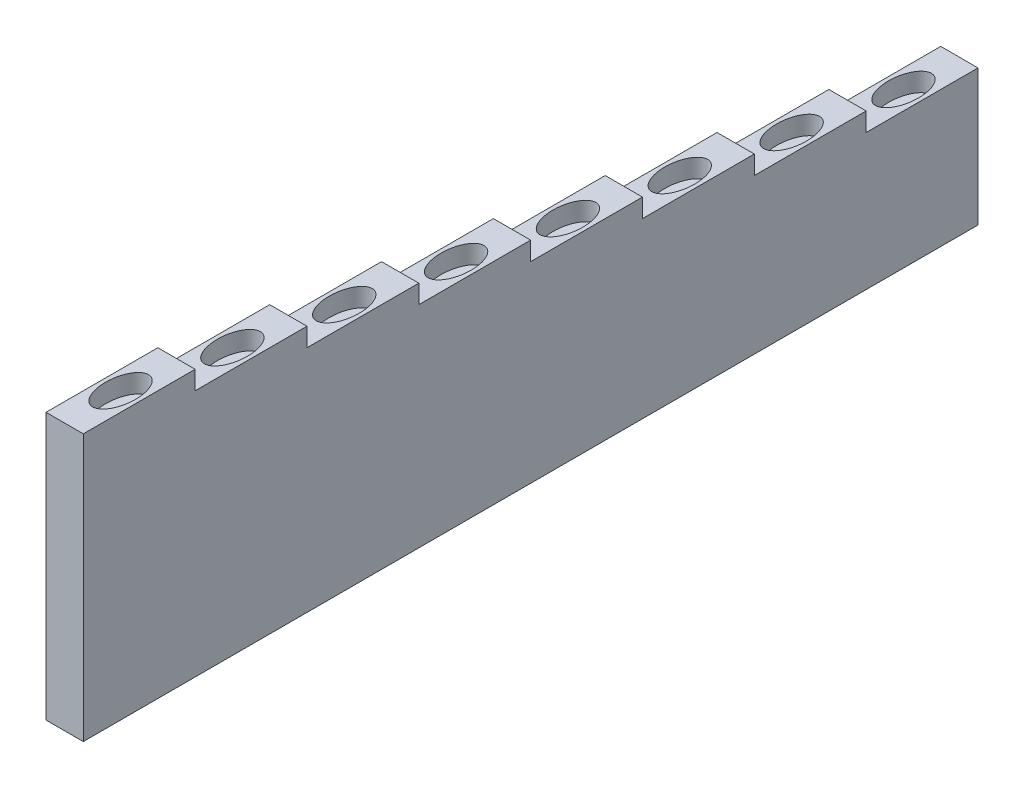
ISO-10303-21;
HEADER;
FILE_DESCRIPTION(('STEP AP214'),'2;1');
FILE_NAME('part.step','',(''),(''),'','','');
FILE_SCHEMA(('AUTOMOTIVE_DESIGN { 1 0 10303 214 1 1 1 1 }'));
ENDSEC;
DATA;
#1=APPLICATION_CONTEXT('core data for automotive mechanical design processes');
#2=APPLICATION_PROTOCOL_DEFINITION('international standard','automotive_design',2000,#1);
#3=PRODUCT_CONTEXT('',#1,'mechanical');
#4=PRODUCT('Part','Part','',(#3));
#5=PRODUCT_RELATED_PRODUCT_CATEGORY('part','',(#4));
#6=PRODUCT_DEFINITION_FORMATION('','',#4);
#7=PRODUCT_DEFINITION_CONTEXT('part definition',#1,'design');
#8=PRODUCT_DEFINITION('design','',#6,#7);
#9=PRODUCT_DEFINITION_SHAPE('','',#8);
#10=(LENGTH_UNIT() NAMED_UNIT(*) SI_UNIT(.MILLI.,.METRE.));
#11=(NAMED_UNIT(*) PLANE_ANGLE_UNIT() SI_UNIT($,.RADIAN.));
#12=(NAMED_UNIT(*) SI_UNIT($,.STERADIAN.) SOLID_ANGLE_UNIT());
#13=UNCERTAINTY_MEASURE_WITH_UNIT(LENGTH_MEASURE(1.E-05),#10,'distance_accuracy_value','');
#14=(GEOMETRIC_REPRESENTATION_CONTEXT(3) GLOBAL_UNCERTAINTY_ASSIGNED_CONTEXT((#13)) GLOBAL_UNIT_ASSIGNED_CONTEXT((#10,
#11,#12)) REPRESENTATION_CONTEXT('',''));
#15=CARTESIAN_POINT('',(0.,0.,0.));
#16=DIRECTION('',(0.,0.,1.));
#17=DIRECTION('',(1.,0.,0.));
#18=AXIS2_PLACEMENT_3D('',#15,#16,#17);
#19=CARTESIAN_POINT('',(-7.23000000000018,15.7,48.));
#20=DIRECTION('',(-1.,0.,0.));
#21=DIRECTION('',(0.,-1.,0.));
#22=AXIS2_PLACEMENT_3D('',#19,#20,#21);
#23=PLANE('',#22);
#24=DIRECTION('',(0.,1.,0.));
#25=VECTOR('',#24,1.);
#26=CARTESIAN_POINT('',(-7.23000000000006,-2.,42.));
#27=LINE('',#26,#25);
#28=CARTESIAN_POINT('',(-7.23000000000005,-3.00000000000001,42.));
#29=VERTEX_POINT('',#28);
#30=CARTESIAN_POINT('',(-7.23000000000006,-2.,42.));
#31=VERTEX_POINT('',#30);
#32=EDGE_CURVE('E197',#29,#31,#27,.T.);
#33=ORIENTED_EDGE('',*,*,#32,.T.);
#34=DIRECTION('',(0.,0.,1.));
#35=VECTOR('',#34,1.);
#36=CARTESIAN_POINT('',(-7.23000000000006,-2.,48.));
#37=LINE('',#36,#35);
#38=CARTESIAN_POINT('',(-7.23000000000006,-2.,48.));
#39=VERTEX_POINT('',#38);
#40=EDGE_CURVE('E184',#31,#39,#37,.T.);
#41=ORIENTED_EDGE('',*,*,#40,.T.);
#42=DIRECTION('',(0.,1.,0.));
#43=VECTOR('',#42,1.);
#44=CARTESIAN_POINT('',(-7.23000000000018,15.7,48.));
#45=LINE('',#44,#43);
#46=CARTESIAN_POINT('',(-7.22999999999996,-16.3,48.));
#47=VERTEX_POINT('',#46);
#48=EDGE_CURVE('E183',#47,#39,#45,.T.);
#49=ORIENTED_EDGE('',*,*,#48,.F.);
#50=DIRECTION('',(0.,0.,-1.));
#51=VECTOR('',#50,1.);
#52=CARTESIAN_POINT('',(-7.22999999999996,-16.3,48.));
#53=LINE('',#52,#51);
#54=CARTESIAN_POINT('',(-7.22999999999996,-16.3,0.));
#55=VERTEX_POINT('',#54);
#56=EDGE_CURVE('E167',#47,#55,#53,.T.);
#57=ORIENTED_EDGE('',*,*,#56,.T.);
#58=DIRECTION('',(0.,1.,0.));
#59=VECTOR('',#58,1.);
#60=CARTESIAN_POINT('',(-7.23000000000018,15.7,0.));
#61=LINE('',#60,#59);
#62=CARTESIAN_POINT('',(-7.23000000000001,-9.00000000000002,0.));
#63=VERTEX_POINT('',#62);
#64=EDGE_CURVE('E180',#55,#63,#61,.T.);
#65=ORIENTED_EDGE('',*,*,#64,.T.);
#66=DIRECTION('',(0.,0.,1.));
#67=VECTOR('',#66,1.);
#68=CARTESIAN_POINT('',(-7.23000000000001,-9.00000000000002,6.00000000000001));
#69=LINE('',#68,#67);
#70=CARTESIAN_POINT('',(-7.23000000000001,-9.00000000000002,6.00000000000001));
#71=VERTEX_POINT('',#70);
#72=EDGE_CURVE('E187',#63,#71,#69,.T.);
#73=ORIENTED_EDGE('',*,*,#72,.T.);
#74=DIRECTION('',(0.,1.,0.));
#75=VECTOR('',#74,1.);
#76=CARTESIAN_POINT('',(-7.23000000000001,-8.00000000000002,6.00000000000001));
#77=LINE('',#76,#75);
#78=CARTESIAN_POINT('',(-7.23000000000001,-8.00000000000002,6.00000000000001));
#79=VERTEX_POINT('',#78);
#80=EDGE_CURVE('E189',#71,#79,#77,.T.);
#81=ORIENTED_EDGE('',*,*,#80,.T.);
#82=DIRECTION('',(0.,0.,1.));
#83=VECTOR('',#82,1.);
#84=CARTESIAN_POINT('',(-7.23000000000001,-8.00000000000002,12.));
#85=LINE('',#84,#83);
#86=CARTESIAN_POINT('',(-7.23000000000001,-8.00000000000002,12.));
#87=VERTEX_POINT('',#86);
#88=EDGE_CURVE('E387',#79,#87,#85,.T.);
#89=ORIENTED_EDGE('',*,*,#88,.T.);
#90=DIRECTION('',(0.,1.,0.));
#91=VECTOR('',#90,1.);
#92=CARTESIAN_POINT('',(-7.23000000000002,-7.00000000000002,12.));
#93=LINE('',#92,#91);
#94=CARTESIAN_POINT('',(-7.23000000000002,-7.00000000000002,12.));
#95=VERTEX_POINT('',#94);
#96=EDGE_CURVE('E390',#87,#95,#93,.T.);
#97=ORIENTED_EDGE('',*,*,#96,.T.);
#98=DIRECTION('',(0.,0.,1.));
#99=VECTOR('',#98,1.);
#100=CARTESIAN_POINT('',(-7.23000000000002,-7.00000000000002,18.));
#101=LINE('',#100,#99);
#102=CARTESIAN_POINT('',(-7.23000000000002,-7.00000000000002,18.));
#103=VERTEX_POINT('',#102);
#104=EDGE_CURVE('E393',#95,#103,#101,.T.);
#105=ORIENTED_EDGE('',*,*,#104,.T.);
#106=DIRECTION('',(0.,1.,0.));
#107=VECTOR('',#106,1.);
#108=CARTESIAN_POINT('',(-7.23000000000003,-6.00000000000002,18.));
#109=LINE('',#108,#107);
#110=CARTESIAN_POINT('',(-7.23000000000003,-6.00000000000002,18.));
#111=VERTEX_POINT('',#110);
#112=EDGE_CURVE('E396',#103,#111,#109,.T.);
#113=ORIENTED_EDGE('',*,*,#112,.T.);
#114=DIRECTION('',(0.,0.,1.));
#115=VECTOR('',#114,1.);
#116=CARTESIAN_POINT('',(-7.23000000000003,-6.00000000000001,24.));
#117=LINE('',#116,#115);
#118=CARTESIAN_POINT('',(-7.23000000000003,-6.00000000000001,24.));
#119=VERTEX_POINT('',#118);
#120=EDGE_CURVE('E399',#111,#119,#117,.T.);
#121=ORIENTED_EDGE('',*,*,#120,.T.);
#122=DIRECTION('',(0.,1.,0.));
#123=VECTOR('',#122,1.);
#124=CARTESIAN_POINT('',(-7.23000000000004,-5.00000000000001,24.));
#125=LINE('',#124,#123);
#126=CARTESIAN_POINT('',(-7.23000000000004,-5.00000000000001,24.));
#127=VERTEX_POINT('',#126);
#128=EDGE_CURVE('E402',#119,#127,#125,.T.);
#129=ORIENTED_EDGE('',*,*,#128,.T.);
#130=DIRECTION('',(0.,0.,1.));
#131=VECTOR('',#130,1.);
#132=CARTESIAN_POINT('',(-7.23000000000004,-5.00000000000001,30.));
#133=LINE('',#132,#131);
#134=CARTESIAN_POINT('',(-7.23000000000004,-5.00000000000001,30.));
#135=VERTEX_POINT('',#134);
#136=EDGE_CURVE('E405',#127,#135,#133,.T.);
#137=ORIENTED_EDGE('',*,*,#136,.T.);
#138=DIRECTION('',(0.,1.,0.));
#139=VECTOR('',#138,1.);
#140=CARTESIAN_POINT('',(-7.23000000000004,-4.00000000000001,30.));
#141=LINE('',#140,#139);
#142=CARTESIAN_POINT('',(-7.23000000000004,-4.00000000000001,30.));
#143=VERTEX_POINT('',#142);
#144=EDGE_CURVE('E408',#135,#143,#141,.T.);
#145=ORIENTED_EDGE('',*,*,#144,.T.);
#146=DIRECTION('',(0.,0.,1.));
#147=VECTOR('',#146,1.);
#148=CARTESIAN_POINT('',(-7.23000000000004,-4.00000000000001,36.));
#149=LINE('',#148,#147);
#150=CARTESIAN_POINT('',(-7.23000000000004,-4.00000000000001,36.));
#151=VERTEX_POINT('',#150);
#152=EDGE_CURVE('E411',#143,#151,#149,.T.);
#153=ORIENTED_EDGE('',*,*,#152,.T.);
#154=DIRECTION('',(0.,1.,0.));
#155=VECTOR('',#154,1.);
#156=CARTESIAN_POINT('',(-7.23000000000005,-3.00000000000001,36.));
#157=LINE('',#156,#155);
#158=CARTESIAN_POINT('',(-7.23000000000005,-3.00000000000001,36.));
#159=VERTEX_POINT('',#158);
#160=EDGE_CURVE('E414',#151,#159,#157,.T.);
#161=ORIENTED_EDGE('',*,*,#160,.T.);
#162=DIRECTION('',(0.,0.,1.));
#163=VECTOR('',#162,1.);
#164=CARTESIAN_POINT('',(-7.23000000000005,-3.00000000000001,42.));
#165=LINE('',#164,#163);
#166=EDGE_CURVE('E417',#159,#29,#165,.T.);
#167=ORIENTED_EDGE('',*,*,#166,.T.);
#168=EDGE_LOOP('',(#33,#41,#49,#57,#65,#73,#81,#89,#97,#105,#113,#121,#129,#137,#145,#153,#161,#167));
#169=FACE_BOUND('',#168,.T.);
#170=ADVANCED_FACE('F35',(#169),#23,.F.);
#171=CARTESIAN_POINT('',(-9.23000000000009,1.99999999999998,48.));
#172=DIRECTION('',(1.,0.,0.));
#173=DIRECTION('',(0.,1.,0.));
#174=AXIS2_PLACEMENT_3D('',#171,#172,#173);
#175=PLANE('',#174);
#176=DIRECTION('',(0.,-1.,0.));
#177=VECTOR('',#176,1.);
#178=CARTESIAN_POINT('',(-9.22999999999995,-16.3,48.));
#179=LINE('',#178,#177);
#180=CARTESIAN_POINT('',(-9.23000000000006,-2.00000000000001,48.));
#181=VERTEX_POINT('',#180);
#182=CARTESIAN_POINT('',(-9.22999999999995,-16.3,48.));
#183=VERTEX_POINT('',#182);
#184=EDGE_CURVE('E375',#181,#183,#179,.T.);
#185=ORIENTED_EDGE('',*,*,#184,.F.);
#186=DIRECTION('',(0.,0.,1.));
#187=VECTOR('',#186,1.);
#188=CARTESIAN_POINT('',(-9.23000000000006,-2.00000000000001,48.));
#189=LINE('',#188,#187);
#190=CARTESIAN_POINT('',(-9.23000000000006,-2.00000000000001,42.));
#191=VERTEX_POINT('',#190);
#192=EDGE_CURVE('E377',#191,#181,#189,.T.);
#193=ORIENTED_EDGE('',*,*,#192,.F.);
#194=DIRECTION('',(0.,1.,0.));
#195=VECTOR('',#194,1.);
#196=CARTESIAN_POINT('',(-9.23000000000006,-2.00000000000001,42.));
#197=LINE('',#196,#195);
#198=CARTESIAN_POINT('',(-9.23000000000005,-3.00000000000002,42.));
#199=VERTEX_POINT('',#198);
#200=EDGE_CURVE('E469',#199,#191,#197,.T.);
#201=ORIENTED_EDGE('',*,*,#200,.F.);
#202=DIRECTION('',(0.,0.,1.));
#203=VECTOR('',#202,1.);
#204=CARTESIAN_POINT('',(-9.23000000000005,-3.00000000000002,42.));
#205=LINE('',#204,#203);
#206=CARTESIAN_POINT('',(-9.23000000000005,-3.00000000000002,36.));
#207=VERTEX_POINT('',#206);
#208=EDGE_CURVE('E465',#207,#199,#205,.T.);
#209=ORIENTED_EDGE('',*,*,#208,.F.);
#210=DIRECTION('',(0.,1.,0.));
#211=VECTOR('',#210,1.);
#212=CARTESIAN_POINT('',(-9.23000000000005,-3.00000000000002,36.));
#213=LINE('',#212,#211);
#214=CARTESIAN_POINT('',(-9.23000000000004,-4.00000000000002,36.));
#215=VERTEX_POINT('',#214);
#216=EDGE_CURVE('E461',#215,#207,#213,.T.);
#217=ORIENTED_EDGE('',*,*,#216,.F.);
#218=DIRECTION('',(0.,0.,1.));
#219=VECTOR('',#218,1.);
#220=CARTESIAN_POINT('',(-9.23000000000004,-4.00000000000002,36.));
#221=LINE('',#220,#219);
#222=CARTESIAN_POINT('',(-9.23000000000004,-4.00000000000002,30.));
#223=VERTEX_POINT('',#222);
#224=EDGE_CURVE('E457',#223,#215,#221,.T.);
#225=ORIENTED_EDGE('',*,*,#224,.F.);
#226=DIRECTION('',(0.,1.,0.));
#227=VECTOR('',#226,1.);
#228=CARTESIAN_POINT('',(-9.23000000000004,-4.00000000000002,30.));
#229=LINE('',#228,#227);
#230=CARTESIAN_POINT('',(-9.23000000000004,-5.00000000000002,30.));
#231=VERTEX_POINT('',#230);
#232=EDGE_CURVE('E453',#231,#223,#229,.T.);
#233=ORIENTED_EDGE('',*,*,#232,.F.);
#234=DIRECTION('',(0.,0.,1.));
#235=VECTOR('',#234,1.);
#236=CARTESIAN_POINT('',(-9.23000000000004,-5.00000000000002,30.));
#237=LINE('',#236,#235);
#238=CARTESIAN_POINT('',(-9.23000000000004,-5.00000000000003,24.));
#239=VERTEX_POINT('',#238);
#240=EDGE_CURVE('E449',#239,#231,#237,.T.);
#241=ORIENTED_EDGE('',*,*,#240,.F.);
#242=DIRECTION('',(0.,1.,0.));
#243=VECTOR('',#242,1.);
#244=CARTESIAN_POINT('',(-9.23000000000004,-5.00000000000003,24.));
#245=LINE('',#244,#243);
#246=CARTESIAN_POINT('',(-9.23000000000003,-6.00000000000003,24.));
#247=VERTEX_POINT('',#246);
#248=EDGE_CURVE('E445',#247,#239,#245,.T.);
#249=ORIENTED_EDGE('',*,*,#248,.F.);
#250=DIRECTION('',(0.,0.,1.));
#251=VECTOR('',#250,1.);
#252=CARTESIAN_POINT('',(-9.23000000000003,-6.00000000000003,24.));
#253=LINE('',#252,#251);
#254=CARTESIAN_POINT('',(-9.23000000000003,-6.00000000000003,18.));
#255=VERTEX_POINT('',#254);
#256=EDGE_CURVE('E441',#255,#247,#253,.T.);
#257=ORIENTED_EDGE('',*,*,#256,.F.);
#258=DIRECTION('',(0.,1.,0.));
#259=VECTOR('',#258,1.);
#260=CARTESIAN_POINT('',(-9.23000000000003,-6.00000000000003,18.));
#261=LINE('',#260,#259);
#262=CARTESIAN_POINT('',(-9.23000000000002,-7.00000000000003,18.));
#263=VERTEX_POINT('',#262);
#264=EDGE_CURVE('E437',#263,#255,#261,.T.);
#265=ORIENTED_EDGE('',*,*,#264,.F.);
#266=DIRECTION('',(0.,0.,1.));
#267=VECTOR('',#266,1.);
#268=CARTESIAN_POINT('',(-9.23000000000002,-7.00000000000003,18.));
#269=LINE('',#268,#267);
#270=CARTESIAN_POINT('',(-9.23000000000002,-7.00000000000003,12.));
#271=VERTEX_POINT('',#270);
#272=EDGE_CURVE('E433',#271,#263,#269,.T.);
#273=ORIENTED_EDGE('',*,*,#272,.F.);
#274=DIRECTION('',(0.,1.,0.));
#275=VECTOR('',#274,1.);
#276=CARTESIAN_POINT('',(-9.23000000000002,-7.00000000000003,12.));
#277=LINE('',#276,#275);
#278=CARTESIAN_POINT('',(-9.23000000000001,-8.00000000000003,12.));
#279=VERTEX_POINT('',#278);
#280=EDGE_CURVE('E429',#279,#271,#277,.T.);
#281=ORIENTED_EDGE('',*,*,#280,.F.);
#282=DIRECTION('',(0.,0.,1.));
#283=VECTOR('',#282,1.);
#284=CARTESIAN_POINT('',(-9.23000000000001,-8.00000000000003,12.));
#285=LINE('',#284,#283);
#286=CARTESIAN_POINT('',(-9.23000000000001,-8.00000000000004,6.00000000000001));
#287=VERTEX_POINT('',#286);
#288=EDGE_CURVE('E426',#287,#279,#285,.T.);
#289=ORIENTED_EDGE('',*,*,#288,.F.);
#290=DIRECTION('',(0.,1.,0.));
#291=VECTOR('',#290,1.);
#292=CARTESIAN_POINT('',(-9.23000000000001,-8.00000000000004,6.00000000000001));
#293=LINE('',#292,#291);
#294=CARTESIAN_POINT('',(-9.23000000000001,-9.00000000000003,6.00000000000001));
#295=VERTEX_POINT('',#294);
#296=EDGE_CURVE('E424',#295,#287,#293,.T.);
#297=ORIENTED_EDGE('',*,*,#296,.F.);
#298=DIRECTION('',(0.,0.,1.));
#299=VECTOR('',#298,1.);
#300=CARTESIAN_POINT('',(-9.23000000000001,-9.00000000000003,6.00000000000001));
#301=LINE('',#300,#299);
#302=CARTESIAN_POINT('',(-9.23000000000001,-9.00000000000003,0.));
#303=VERTEX_POINT('',#302);
#304=EDGE_CURVE('E44',#303,#295,#301,.T.);
#305=ORIENTED_EDGE('',*,*,#304,.F.);
#306=DIRECTION('',(0.,-1.,0.));
#307=VECTOR('',#306,1.);
#308=CARTESIAN_POINT('',(-9.23000000000009,1.99999999999998,0.));
#309=LINE('',#308,#307);
#310=CARTESIAN_POINT('',(-9.22999999999995,-16.3,0.));
#311=VERTEX_POINT('',#310);
#312=EDGE_CURVE('E174',#303,#311,#309,.T.);
#313=ORIENTED_EDGE('',*,*,#312,.T.);
#314=DIRECTION('',(0.,0.,-1.));
#315=VECTOR('',#314,1.);
#316=CARTESIAN_POINT('',(-9.22999999999995,-16.3,48.));
#317=LINE('',#316,#315);
#318=EDGE_CURVE('E170',#183,#311,#317,.T.);
#319=ORIENTED_EDGE('',*,*,#318,.F.);
#320=EDGE_LOOP('',(#185,#193,#201,#209,#217,#225,#233,#241,#249,#257,#265,#273,#281,#289,#297,
#305,#313,#319));
#321=FACE_BOUND('',#320,.T.);
#322=ADVANCED_FACE('F365',(#321),#175,.F.);
#323=CARTESIAN_POINT('',(-16.4599999999999,-18.3000000000001,0.));
#324=DIRECTION('',(0.,0.,-1.));
#325=DIRECTION('',(1.,0.,0.));
#326=AXIS2_PLACEMENT_3D('',#323,#324,#325);
#327=PLANE('',#326);
#328=DIRECTION('',(-1.,0.,0.));
#329=VECTOR('',#328,1.);
#330=CARTESIAN_POINT('',(-7.23000000000001,-9.00000000000002,0.));
#331=LINE('',#330,#329);
#332=EDGE_CURVE('E11',#63,#303,#331,.T.);
#333=ORIENTED_EDGE('',*,*,#332,.F.);
#334=ORIENTED_EDGE('',*,*,#64,.F.);
#335=DIRECTION('',(1.,0.,0.));
#336=VECTOR('',#335,1.);
#337=CARTESIAN_POINT('',(-7.22999999999996,-16.3,0.));
#338=LINE('',#337,#336);
#339=EDGE_CURVE('E163',#311,#55,#338,.T.);
#340=ORIENTED_EDGE('',*,*,#339,.F.);
#341=ORIENTED_EDGE('',*,*,#312,.F.);
#342=EDGE_LOOP('',(#333,#334,#340,#341));
#343=FACE_BOUND('',#342,.T.);
#344=ADVANCED_FACE('F186',(#343),#327,.T.);
#345=CARTESIAN_POINT('',(-7.22999999999996,-16.3,48.));
#346=DIRECTION('',(0.,1.,0.));
#347=DIRECTION('',(0.,0.,-1.));
#348=AXIS2_PLACEMENT_3D('',#345,#346,#347);
#349=PLANE('',#348);
#350=ORIENTED_EDGE('',*,*,#339,.T.);
#351=ORIENTED_EDGE('',*,*,#56,.F.);
#352=DIRECTION('',(1.,0.,0.));
#353=VECTOR('',#352,1.);
#354=CARTESIAN_POINT('',(-7.22999999999996,-16.3,48.));
#355=LINE('',#354,#353);
#356=EDGE_CURVE('E379',#183,#47,#355,.T.);
#357=ORIENTED_EDGE('',*,*,#356,.F.);
#358=ORIENTED_EDGE('',*,*,#318,.T.);
#359=EDGE_LOOP('',(#350,#351,#357,#358));
#360=FACE_BOUND('',#359,.T.);
#361=ADVANCED_FACE('F165',(#360),#349,.F.);
#362=CARTESIAN_POINT('',(-16.4599999999999,-18.3000000000001,48.));
#363=DIRECTION('',(0.,0.,-1.));
#364=DIRECTION('',(1.,0.,0.));
#365=AXIS2_PLACEMENT_3D('',#362,#363,#364);
#366=PLANE('',#365);
#367=ORIENTED_EDGE('',*,*,#48,.T.);
#368=DIRECTION('',(-1.,0.,0.));
#369=VECTOR('',#368,1.);
#370=CARTESIAN_POINT('',(-7.23000000000006,-2.,48.));
#371=LINE('',#370,#369);
#372=EDGE_CURVE('E380',#39,#181,#371,.T.);
#373=ORIENTED_EDGE('',*,*,#372,.T.);
#374=ORIENTED_EDGE('',*,*,#184,.T.);
#375=ORIENTED_EDGE('',*,*,#356,.T.);
#376=EDGE_LOOP('',(#367,#373,#374,#375));
#377=FACE_BOUND('',#376,.T.);
#378=ADVANCED_FACE('F304',(#377),#366,.F.);
#379=CARTESIAN_POINT('',(-7.23000000000006,-2.,48.));
#380=DIRECTION('',(0.,-1.,0.));
#381=DIRECTION('',(1.,0.,0.));
#382=AXIS2_PLACEMENT_3D('',#379,#380,#381);
#383=PLANE('',#382);
#384=CARTESIAN_POINT('',(-8.23000000000006,-2.00000000000001,45.));
#385=DIRECTION('',(0.,-1.,0.));
#386=DIRECTION('',(0.,0.,-1.));
#387=AXIS2_PLACEMENT_3D('',#384,#385,#386);
#388=ELLIPSE('',#387,1.5,0.8);
#389=CARTESIAN_POINT('',(-8.23000000000006,-2.00000000000001,43.5));
#390=VERTEX_POINT('',#389);
#391=EDGE_CURVE('E194',#390,#390,#388,.F.);
#392=ORIENTED_EDGE('',*,*,#391,.F.);
#393=EDGE_LOOP('',(#392));
#394=FACE_BOUND('',#393,.T.);
#395=ORIENTED_EDGE('',*,*,#192,.T.);
#396=ORIENTED_EDGE('',*,*,#372,.F.);
#397=ORIENTED_EDGE('',*,*,#40,.F.);
#398=DIRECTION('',(-1.,0.,0.));
#399=VECTOR('',#398,1.);
#400=CARTESIAN_POINT('',(-7.23000000000006,-2.,42.));
#401=LINE('',#400,#399);
#402=EDGE_CURVE('E472',#31,#191,#401,.T.);
#403=ORIENTED_EDGE('',*,*,#402,.T.);
#404=EDGE_LOOP('',(#395,#396,#397,#403));
#405=FACE_BOUND('',#404,.T.);
#406=ADVANCED_FACE('F358',(#394,#405),#383,.F.);
#407=CARTESIAN_POINT('',(-7.23000000000006,-2.,42.));
#408=DIRECTION('',(0.,0.,1.));
#409=DIRECTION('',(-1.,0.,0.));
#410=AXIS2_PLACEMENT_3D('',#407,#408,#409);
#411=PLANE('',#410);
#412=ORIENTED_EDGE('',*,*,#200,.T.);
#413=ORIENTED_EDGE('',*,*,#402,.F.);
#414=ORIENTED_EDGE('',*,*,#32,.F.);
#415=DIRECTION('',(-1.,0.,0.));
#416=VECTOR('',#415,1.);
#417=CARTESIAN_POINT('',(-7.23000000000005,-3.00000000000001,42.));
#418=LINE('',#417,#416);
#419=EDGE_CURVE('E468',#29,#199,#418,.T.);
#420=ORIENTED_EDGE('',*,*,#419,.T.);
#421=EDGE_LOOP('',(#412,#413,#414,#420));
#422=FACE_BOUND('',#421,.T.);
#423=ADVANCED_FACE('F354',(#422),#411,.F.);
#424=CARTESIAN_POINT('',(-7.23000000000005,-3.00000000000001,42.));
#425=DIRECTION('',(0.,-1.,0.));
#426=DIRECTION('',(0.,0.,1.));
#427=AXIS2_PLACEMENT_3D('',#424,#425,#426);
#428=PLANE('',#427);
#429=CARTESIAN_POINT('',(-8.23000000000005,-3.00000000000001,39.));
#430=DIRECTION('',(0.,-1.,0.));
#431=DIRECTION('',(0.,0.,-1.));
#432=AXIS2_PLACEMENT_3D('',#429,#430,#431);
#433=ELLIPSE('',#432,1.5,0.8);
#434=CARTESIAN_POINT('',(-8.23000000000005,-3.00000000000001,37.5));
#435=VERTEX_POINT('',#434);
#436=EDGE_CURVE('E199',#435,#435,#433,.F.);
#437=ORIENTED_EDGE('',*,*,#436,.F.);
#438=EDGE_LOOP('',(#437));
#439=FACE_BOUND('',#438,.T.);
#440=ORIENTED_EDGE('',*,*,#208,.T.);
#441=ORIENTED_EDGE('',*,*,#419,.F.);
#442=ORIENTED_EDGE('',*,*,#166,.F.);
#443=DIRECTION('',(-1.,0.,0.));
#444=VECTOR('',#443,1.);
#445=CARTESIAN_POINT('',(-7.23000000000005,-3.00000000000001,36.));
#446=LINE('',#445,#444);
#447=EDGE_CURVE('E464',#159,#207,#446,.T.);
#448=ORIENTED_EDGE('',*,*,#447,.T.);
#449=EDGE_LOOP('',(#440,#441,#442,#448));
#450=FACE_BOUND('',#449,.T.);
#451=ADVANCED_FACE('F350',(#439,#450),#428,.F.);
#452=CARTESIAN_POINT('',(-7.23000000000005,-3.00000000000001,36.));
#453=DIRECTION('',(0.,0.,1.));
#454=DIRECTION('',(-1.,0.,0.));
#455=AXIS2_PLACEMENT_3D('',#452,#453,#454);
#456=PLANE('',#455);
#457=ORIENTED_EDGE('',*,*,#216,.T.);
#458=ORIENTED_EDGE('',*,*,#447,.F.);
#459=ORIENTED_EDGE('',*,*,#160,.F.);
#460=DIRECTION('',(-1.,0.,0.));
#461=VECTOR('',#460,1.);
#462=CARTESIAN_POINT('',(-7.23000000000004,-4.00000000000001,36.));
#463=LINE('',#462,#461);
#464=EDGE_CURVE('E460',#151,#215,#463,.T.);
#465=ORIENTED_EDGE('',*,*,#464,.T.);
#466=EDGE_LOOP('',(#457,#458,#459,#465));
#467=FACE_BOUND('',#466,.T.);
#468=ADVANCED_FACE('F346',(#467),#456,.F.);
#469=CARTESIAN_POINT('',(-7.23000000000004,-4.00000000000001,36.));
#470=DIRECTION('',(0.,-1.,0.));
#471=DIRECTION('',(0.,0.,1.));
#472=AXIS2_PLACEMENT_3D('',#469,#470,#471);
#473=PLANE('',#472);
#474=CARTESIAN_POINT('',(-8.23000000000004,-4.00000000000002,33.));
#475=DIRECTION('',(0.,-1.,0.));
#476=DIRECTION('',(0.,0.,-1.));
#477=AXIS2_PLACEMENT_3D('',#474,#475,#476);
#478=ELLIPSE('',#477,1.5,0.8);
#479=CARTESIAN_POINT('',(-8.23000000000004,-4.00000000000002,31.5));
#480=VERTEX_POINT('',#479);
#481=EDGE_CURVE('E203',#480,#480,#478,.F.);
#482=ORIENTED_EDGE('',*,*,#481,.F.);
#483=EDGE_LOOP('',(#482));
#484=FACE_BOUND('',#483,.T.);
#485=ORIENTED_EDGE('',*,*,#224,.T.);
#486=ORIENTED_EDGE('',*,*,#464,.F.);
#487=ORIENTED_EDGE('',*,*,#152,.F.);
#488=DIRECTION('',(-1.,0.,0.));
#489=VECTOR('',#488,1.);
#490=CARTESIAN_POINT('',(-7.23000000000004,-4.00000000000001,30.));
#491=LINE('',#490,#489);
#492=EDGE_CURVE('E456',#143,#223,#491,.T.);
#493=ORIENTED_EDGE('',*,*,#492,.T.);
#494=EDGE_LOOP('',(#485,#486,#487,#493));
#495=FACE_BOUND('',#494,.T.);
#496=ADVANCED_FACE('F342',(#484,#495),#473,.F.);
#497=CARTESIAN_POINT('',(-7.23000000000004,-4.00000000000001,30.));
#498=DIRECTION('',(0.,0.,1.));
#499=DIRECTION('',(-1.,0.,0.));
#500=AXIS2_PLACEMENT_3D('',#497,#498,#499);
#501=PLANE('',#500);
#502=ORIENTED_EDGE('',*,*,#232,.T.);
#503=ORIENTED_EDGE('',*,*,#492,.F.);
#504=ORIENTED_EDGE('',*,*,#144,.F.);
#505=DIRECTION('',(-1.,0.,0.));
#506=VECTOR('',#505,1.);
#507=CARTESIAN_POINT('',(-7.23000000000004,-5.00000000000001,30.));
#508=LINE('',#507,#506);
#509=EDGE_CURVE('E452',#135,#231,#508,.T.);
#510=ORIENTED_EDGE('',*,*,#509,.T.);
#511=EDGE_LOOP('',(#502,#503,#504,#510));
#512=FACE_BOUND('',#511,.T.);
#513=ADVANCED_FACE('F338',(#512),#501,.F.);
#514=CARTESIAN_POINT('',(-7.23000000000004,-5.00000000000001,30.));
#515=DIRECTION('',(0.,-1.,0.));
#516=DIRECTION('',(0.,0.,1.));
#517=AXIS2_PLACEMENT_3D('',#514,#515,#516);
#518=PLANE('',#517);
#519=CARTESIAN_POINT('',(-8.23000000000004,-5.00000000000002,27.));
#520=DIRECTION('',(0.,-1.,0.));
#521=DIRECTION('',(0.,0.,-1.));
#522=AXIS2_PLACEMENT_3D('',#519,#520,#521);
#523=ELLIPSE('',#522,1.5,0.8);
#524=CARTESIAN_POINT('',(-8.23000000000004,-5.00000000000002,25.5));
#525=VERTEX_POINT('',#524);
#526=EDGE_CURVE('E207',#525,#525,#523,.F.);
#527=ORIENTED_EDGE('',*,*,#526,.F.);
#528=EDGE_LOOP('',(#527));
#529=FACE_BOUND('',#528,.T.);
#530=ORIENTED_EDGE('',*,*,#240,.T.);
#531=ORIENTED_EDGE('',*,*,#509,.F.);
#532=ORIENTED_EDGE('',*,*,#136,.F.);
#533=DIRECTION('',(-1.,0.,0.));
#534=VECTOR('',#533,1.);
#535=CARTESIAN_POINT('',(-7.23000000000004,-5.00000000000001,24.));
#536=LINE('',#535,#534);
#537=EDGE_CURVE('E448',#127,#239,#536,.T.);
#538=ORIENTED_EDGE('',*,*,#537,.T.);
#539=EDGE_LOOP('',(#530,#531,#532,#538));
#540=FACE_BOUND('',#539,.T.);
#541=ADVANCED_FACE('F334',(#529,#540),#518,.F.);
#542=CARTESIAN_POINT('',(-7.23000000000004,-5.00000000000001,24.));
#543=DIRECTION('',(0.,0.,1.));
#544=DIRECTION('',(0.,1.,0.));
#545=AXIS2_PLACEMENT_3D('',#542,#543,#544);
#546=PLANE('',#545);
#547=ORIENTED_EDGE('',*,*,#248,.T.);
#548=ORIENTED_EDGE('',*,*,#537,.F.);
#549=ORIENTED_EDGE('',*,*,#128,.F.);
#550=DIRECTION('',(-1.,0.,0.));
#551=VECTOR('',#550,1.);
#552=CARTESIAN_POINT('',(-7.23000000000003,-6.00000000000001,24.));
#553=LINE('',#552,#551);
#554=EDGE_CURVE('E444',#119,#247,#553,.T.);
#555=ORIENTED_EDGE('',*,*,#554,.T.);
#556=EDGE_LOOP('',(#547,#548,#549,#555));
#557=FACE_BOUND('',#556,.T.);
#558=ADVANCED_FACE('F330',(#557),#546,.F.);
#559=CARTESIAN_POINT('',(-7.23000000000003,-6.00000000000001,24.));
#560=DIRECTION('',(0.,-1.,0.));
#561=DIRECTION('',(0.,0.,1.));
#562=AXIS2_PLACEMENT_3D('',#559,#560,#561);
#563=PLANE('',#562);
#564=CARTESIAN_POINT('',(-8.23000000000003,-6.00000000000002,21.));
#565=DIRECTION('',(0.,-1.,0.));
#566=DIRECTION('',(0.,0.,-1.));
#567=AXIS2_PLACEMENT_3D('',#564,#565,#566);
#568=ELLIPSE('',#567,1.5,0.8);
#569=CARTESIAN_POINT('',(-8.23000000000003,-6.00000000000002,19.5));
#570=VERTEX_POINT('',#569);
#571=EDGE_CURVE('E211',#570,#570,#568,.F.);
#572=ORIENTED_EDGE('',*,*,#571,.F.);
#573=EDGE_LOOP('',(#572));
#574=FACE_BOUND('',#573,.T.);
#575=ORIENTED_EDGE('',*,*,#256,.T.);
#576=ORIENTED_EDGE('',*,*,#554,.F.);
#577=ORIENTED_EDGE('',*,*,#120,.F.);
#578=DIRECTION('',(-1.,0.,0.));
#579=VECTOR('',#578,1.);
#580=CARTESIAN_POINT('',(-7.23000000000003,-6.00000000000002,18.));
#581=LINE('',#580,#579);
#582=EDGE_CURVE('E440',#111,#255,#581,.T.);
#583=ORIENTED_EDGE('',*,*,#582,.T.);
#584=EDGE_LOOP('',(#575,#576,#577,#583));
#585=FACE_BOUND('',#584,.T.);
#586=ADVANCED_FACE('F326',(#574,#585),#563,.F.);
#587=CARTESIAN_POINT('',(-7.23000000000003,-6.00000000000002,18.));
#588=DIRECTION('',(0.,0.,1.));
#589=DIRECTION('',(-1.,0.,0.));
#590=AXIS2_PLACEMENT_3D('',#587,#588,#589);
#591=PLANE('',#590);
#592=ORIENTED_EDGE('',*,*,#264,.T.);
#593=ORIENTED_EDGE('',*,*,#582,.F.);
#594=ORIENTED_EDGE('',*,*,#112,.F.);
#595=DIRECTION('',(-1.,0.,0.));
#596=VECTOR('',#595,1.);
#597=CARTESIAN_POINT('',(-7.23000000000002,-7.00000000000002,18.));
#598=LINE('',#597,#596);
#599=EDGE_CURVE('E436',#103,#263,#598,.T.);
#600=ORIENTED_EDGE('',*,*,#599,.T.);
#601=EDGE_LOOP('',(#592,#593,#594,#600));
#602=FACE_BOUND('',#601,.T.);
#603=ADVANCED_FACE('F322',(#602),#591,.F.);
#604=CARTESIAN_POINT('',(-7.23000000000002,-7.00000000000002,18.));
#605=DIRECTION('',(0.,-1.,0.));
#606=DIRECTION('',(1.,0.,0.));
#607=AXIS2_PLACEMENT_3D('',#604,#605,#606);
#608=PLANE('',#607);
#609=CARTESIAN_POINT('',(-8.23000000000002,-7.00000000000002,15.));
#610=DIRECTION('',(0.,-1.,0.));
#611=DIRECTION('',(0.,0.,-1.));
#612=AXIS2_PLACEMENT_3D('',#609,#610,#611);
#613=ELLIPSE('',#612,1.5,0.8);
#614=CARTESIAN_POINT('',(-8.23000000000002,-7.00000000000002,13.5));
#615=VERTEX_POINT('',#614);
#616=EDGE_CURVE('E215',#615,#615,#613,.F.);
#617=ORIENTED_EDGE('',*,*,#616,.F.);
#618=EDGE_LOOP('',(#617));
#619=FACE_BOUND('',#618,.T.);
#620=ORIENTED_EDGE('',*,*,#272,.T.);
#621=ORIENTED_EDGE('',*,*,#599,.F.);
#622=ORIENTED_EDGE('',*,*,#104,.F.);
#623=DIRECTION('',(-1.,0.,0.));
#624=VECTOR('',#623,1.);
#625=CARTESIAN_POINT('',(-7.23000000000002,-7.00000000000002,12.));
#626=LINE('',#625,#624);
#627=EDGE_CURVE('E432',#95,#271,#626,.T.);
#628=ORIENTED_EDGE('',*,*,#627,.T.);
#629=EDGE_LOOP('',(#620,#621,#622,#628));
#630=FACE_BOUND('',#629,.T.);
#631=ADVANCED_FACE('F318',(#619,#630),#608,.F.);
#632=CARTESIAN_POINT('',(-7.23000000000002,-7.00000000000002,12.));
#633=DIRECTION('',(0.,0.,1.));
#634=DIRECTION('',(-1.,0.,0.));
#635=AXIS2_PLACEMENT_3D('',#632,#633,#634);
#636=PLANE('',#635);
#637=ORIENTED_EDGE('',*,*,#280,.T.);
#638=ORIENTED_EDGE('',*,*,#627,.F.);
#639=ORIENTED_EDGE('',*,*,#96,.F.);
#640=DIRECTION('',(-1.,0.,0.));
#641=VECTOR('',#640,1.);
#642=CARTESIAN_POINT('',(-7.23000000000001,-8.00000000000002,12.));
#643=LINE('',#642,#641);
#644=EDGE_CURVE('E428',#87,#279,#643,.T.);
#645=ORIENTED_EDGE('',*,*,#644,.T.);
#646=EDGE_LOOP('',(#637,#638,#639,#645));
#647=FACE_BOUND('',#646,.T.);
#648=ADVANCED_FACE('F314',(#647),#636,.F.);
#649=CARTESIAN_POINT('',(-7.23000000000001,-8.00000000000002,12.));
#650=DIRECTION('',(0.,-1.,0.));
#651=DIRECTION('',(0.,0.,1.));
#652=AXIS2_PLACEMENT_3D('',#649,#650,#651);
#653=PLANE('',#652);
#654=CARTESIAN_POINT('',(-8.23000000000001,-8.00000000000002,9.00000000000001));
#655=DIRECTION('',(0.,-1.,0.));
#656=DIRECTION('',(0.,0.,-1.));
#657=AXIS2_PLACEMENT_3D('',#654,#655,#656);
#658=ELLIPSE('',#657,1.5,0.8);
#659=CARTESIAN_POINT('',(-8.23000000000001,-8.00000000000002,7.50000000000001));
#660=VERTEX_POINT('',#659);
#661=EDGE_CURVE('E218',#660,#660,#658,.F.);
#662=ORIENTED_EDGE('',*,*,#661,.F.);
#663=EDGE_LOOP('',(#662));
#664=FACE_BOUND('',#663,.T.);
#665=ORIENTED_EDGE('',*,*,#288,.T.);
#666=ORIENTED_EDGE('',*,*,#644,.F.);
#667=ORIENTED_EDGE('',*,*,#88,.F.);
#668=DIRECTION('',(-1.,0.,0.));
#669=VECTOR('',#668,1.);
#670=CARTESIAN_POINT('',(-7.23000000000001,-8.00000000000002,6.00000000000001));
#671=LINE('',#670,#669);
#672=EDGE_CURVE('E116',#79,#287,#671,.T.);
#673=ORIENTED_EDGE('',*,*,#672,.T.);
#674=EDGE_LOOP('',(#665,#666,#667,#673));
#675=FACE_BOUND('',#674,.T.);
#676=ADVANCED_FACE('F311',(#664,#675),#653,.F.);
#677=CARTESIAN_POINT('',(-7.23000000000001,-8.00000000000002,6.00000000000001));
#678=DIRECTION('',(0.,0.,1.));
#679=DIRECTION('',(0.,1.,0.));
#680=AXIS2_PLACEMENT_3D('',#677,#678,#679);
#681=PLANE('',#680);
#682=ORIENTED_EDGE('',*,*,#296,.T.);
#683=ORIENTED_EDGE('',*,*,#672,.F.);
#684=ORIENTED_EDGE('',*,*,#80,.F.);
#685=DIRECTION('',(-1.,0.,0.));
#686=VECTOR('',#685,1.);
#687=CARTESIAN_POINT('',(-7.23000000000001,-9.00000000000002,6.00000000000001));
#688=LINE('',#687,#686);
#689=EDGE_CURVE('E423',#71,#295,#688,.T.);
#690=ORIENTED_EDGE('',*,*,#689,.T.);
#691=EDGE_LOOP('',(#682,#683,#684,#690));
#692=FACE_BOUND('',#691,.T.);
#693=ADVANCED_FACE('F307',(#692),#681,.F.);
#694=CARTESIAN_POINT('',(-7.23000000000001,-9.00000000000002,6.00000000000001));
#695=DIRECTION('',(0.,-1.,0.));
#696=DIRECTION('',(1.,0.,0.));
#697=AXIS2_PLACEMENT_3D('',#694,#695,#696);
#698=PLANE('',#697);
#699=CARTESIAN_POINT('',(-8.23,-9.00000000000002,3.));
#700=DIRECTION('',(0.,-1.,0.));
#701=DIRECTION('',(0.,0.,-1.));
#702=AXIS2_PLACEMENT_3D('',#699,#700,#701);
#703=ELLIPSE('',#702,1.5,0.8);
#704=CARTESIAN_POINT('',(-8.23,-9.00000000000002,1.5));
#705=VERTEX_POINT('',#704);
#706=EDGE_CURVE('E38',#705,#705,#703,.F.);
#707=ORIENTED_EDGE('',*,*,#706,.F.);
#708=EDGE_LOOP('',(#707));
#709=FACE_BOUND('',#708,.T.);
#710=ORIENTED_EDGE('',*,*,#304,.T.);
#711=ORIENTED_EDGE('',*,*,#689,.F.);
#712=ORIENTED_EDGE('',*,*,#72,.F.);
#713=ORIENTED_EDGE('',*,*,#332,.T.);
#714=EDGE_LOOP('',(#710,#711,#712,#713));
#715=FACE_BOUND('',#714,.T.);
#716=ADVANCED_FACE('F300',(#709,#715),#698,.F.);
#717=CARTESIAN_POINT('',(-8.23000000000005,-3.00000000000001,45.));
#718=DIRECTION('',(0.,-1.,0.));
#719=DIRECTION('',(0.,0.,-1.));
#720=AXIS2_PLACEMENT_3D('',#717,#718,#719);
#721=ELLIPSE('',#720,1.5,0.8);
#722=DIRECTION('',(0.,1.,0.));
#723=VECTOR('',#722,1.);
#724=SURFACE_OF_LINEAR_EXTRUSION('',#721,#723);
#725=CARTESIAN_POINT('',(-8.23000000000005,-3.00000000000001,43.5));
#726=VERTEX_POINT('',#725);
#727=EDGE_CURVE('E198',#726,#726,#721,.T.);
#728=ORIENTED_EDGE('',*,*,#727,.T.);
#729=EDGE_LOOP('',(#728));
#730=FACE_BOUND('',#729,.T.);
#731=ORIENTED_EDGE('',*,*,#391,.T.);
#732=EDGE_LOOP('',(#731));
#733=FACE_BOUND('',#732,.T.);
#734=ADVANCED_FACE('F297',(#730,#733),#724,.T.);
#735=CARTESIAN_POINT('',(-8.23000000000005,-3.00000000000001,45.));
#736=DIRECTION('',(0.,-1.,0.));
#737=DIRECTION('',(1.,0.,0.));
#738=AXIS2_PLACEMENT_3D('',#735,#736,#737);
#739=PLANE('',#738);
#740=ORIENTED_EDGE('',*,*,#727,.F.);
#741=EDGE_LOOP('',(#740));
#742=FACE_BOUND('',#741,.T.);
#743=ADVANCED_FACE('F288',(#742),#739,.F.);
#744=CARTESIAN_POINT('',(-8.23000000000004,-4.,39.));
#745=DIRECTION('',(0.,-1.,0.));
#746=DIRECTION('',(0.,0.,-1.));
#747=AXIS2_PLACEMENT_3D('',#744,#745,#746);
#748=ELLIPSE('',#747,1.5,0.8);
#749=DIRECTION('',(0.,1.,0.));
#750=VECTOR('',#749,1.);
#751=SURFACE_OF_LINEAR_EXTRUSION('',#748,#750);
#752=CARTESIAN_POINT('',(-8.23000000000004,-4.,37.5));
#753=VERTEX_POINT('',#752);
#754=EDGE_CURVE('E202',#753,#753,#748,.T.);
#755=ORIENTED_EDGE('',*,*,#754,.T.);
#756=EDGE_LOOP('',(#755));
#757=FACE_BOUND('',#756,.T.);
#758=ORIENTED_EDGE('',*,*,#436,.T.);
#759=EDGE_LOOP('',(#758));
#760=FACE_BOUND('',#759,.T.);
#761=ADVANCED_FACE('F284',(#757,#760),#751,.T.);
#762=CARTESIAN_POINT('',(-8.23000000000004,-4.,39.));
#763=DIRECTION('',(0.,-1.,0.));
#764=DIRECTION('',(1.,0.,0.));
#765=AXIS2_PLACEMENT_3D('',#762,#763,#764);
#766=PLANE('',#765);
#767=ORIENTED_EDGE('',*,*,#754,.F.);
#768=EDGE_LOOP('',(#767));
#769=FACE_BOUND('',#768,.T.);
#770=ADVANCED_FACE('F280',(#769),#766,.F.);
#771=CARTESIAN_POINT('',(-8.23000000000004,-5.,33.));
#772=DIRECTION('',(0.,-1.,0.));
#773=DIRECTION('',(0.,0.,-1.));
#774=AXIS2_PLACEMENT_3D('',#771,#772,#773);
#775=ELLIPSE('',#774,1.5,0.8);
#776=DIRECTION('',(0.,1.,0.));
#777=VECTOR('',#776,1.);
#778=SURFACE_OF_LINEAR_EXTRUSION('',#775,#777);
#779=CARTESIAN_POINT('',(-8.23000000000004,-5.,31.5));
#780=VERTEX_POINT('',#779);
#781=EDGE_CURVE('E206',#780,#780,#775,.T.);
#782=ORIENTED_EDGE('',*,*,#781,.T.);
#783=EDGE_LOOP('',(#782));
#784=FACE_BOUND('',#783,.T.);
#785=ORIENTED_EDGE('',*,*,#481,.T.);
#786=EDGE_LOOP('',(#785));
#787=FACE_BOUND('',#786,.T.);
#788=ADVANCED_FACE('F276',(#784,#787),#778,.T.);
#789=CARTESIAN_POINT('',(-8.23000000000004,-5.,33.));
#790=DIRECTION('',(0.,-1.,0.));
#791=DIRECTION('',(1.,0.,0.));
#792=AXIS2_PLACEMENT_3D('',#789,#790,#791);
#793=PLANE('',#792);
#794=ORIENTED_EDGE('',*,*,#781,.F.);
#795=EDGE_LOOP('',(#794));
#796=FACE_BOUND('',#795,.T.);
#797=ADVANCED_FACE('F272',(#796),#793,.F.);
#798=CARTESIAN_POINT('',(-8.23000000000003,-6.,27.));
#799=DIRECTION('',(0.,-1.,0.));
#800=DIRECTION('',(0.,0.,-1.));
#801=AXIS2_PLACEMENT_3D('',#798,#799,#800);
#802=ELLIPSE('',#801,1.5,0.8);
#803=DIRECTION('',(0.,1.,0.));
#804=VECTOR('',#803,1.);
#805=SURFACE_OF_LINEAR_EXTRUSION('',#802,#804);
#806=CARTESIAN_POINT('',(-8.23000000000003,-6.,25.5));
#807=VERTEX_POINT('',#806);
#808=EDGE_CURVE('E210',#807,#807,#802,.T.);
#809=ORIENTED_EDGE('',*,*,#808,.T.);
#810=EDGE_LOOP('',(#809));
#811=FACE_BOUND('',#810,.T.);
#812=ORIENTED_EDGE('',*,*,#526,.T.);
#813=EDGE_LOOP('',(#812));
#814=FACE_BOUND('',#813,.T.);
#815=ADVANCED_FACE('F269',(#811,#814),#805,.T.);
#816=CARTESIAN_POINT('',(-8.23000000000003,-6.,27.));
#817=DIRECTION('',(0.,-1.,0.));
#818=DIRECTION('',(1.,0.,0.));
#819=AXIS2_PLACEMENT_3D('',#816,#817,#818);
#820=PLANE('',#819);
#821=ORIENTED_EDGE('',*,*,#808,.F.);
#822=EDGE_LOOP('',(#821));
#823=FACE_BOUND('',#822,.T.);
#824=ADVANCED_FACE('F258',(#823),#820,.F.);
#825=CARTESIAN_POINT('',(-8.23000000000002,-7.,21.));
#826=DIRECTION('',(0.,-1.,0.));
#827=DIRECTION('',(0.,0.,-1.));
#828=AXIS2_PLACEMENT_3D('',#825,#826,#827);
#829=ELLIPSE('',#828,1.5,0.8);
#830=DIRECTION('',(0.,1.,0.));
#831=VECTOR('',#830,1.);
#832=SURFACE_OF_LINEAR_EXTRUSION('',#829,#831);
#833=CARTESIAN_POINT('',(-8.23000000000002,-7.,19.5));
#834=VERTEX_POINT('',#833);
#835=EDGE_CURVE('E214',#834,#834,#829,.T.);
#836=ORIENTED_EDGE('',*,*,#835,.T.);
#837=EDGE_LOOP('',(#836));
#838=FACE_BOUND('',#837,.T.);
#839=ORIENTED_EDGE('',*,*,#571,.T.);
#840=EDGE_LOOP('',(#839));
#841=FACE_BOUND('',#840,.T.);
#842=ADVANCED_FACE('F254',(#838,#841),#832,.T.);
#843=CARTESIAN_POINT('',(-8.23000000000002,-7.,21.));
#844=DIRECTION('',(0.,-1.,0.));
#845=DIRECTION('',(1.,0.,0.));
#846=AXIS2_PLACEMENT_3D('',#843,#844,#845);
#847=PLANE('',#846);
#848=ORIENTED_EDGE('',*,*,#835,.F.);
#849=EDGE_LOOP('',(#848));
#850=FACE_BOUND('',#849,.T.);
#851=ADVANCED_FACE('F250',(#850),#847,.F.);
#852=CARTESIAN_POINT('',(-8.23000000000001,-8.,15.));
#853=DIRECTION('',(0.,-1.,0.));
#854=DIRECTION('',(0.,0.,-1.));
#855=AXIS2_PLACEMENT_3D('',#852,#853,#854);
#856=ELLIPSE('',#855,1.5,0.8);
#857=DIRECTION('',(0.,1.,0.));
#858=VECTOR('',#857,1.);
#859=SURFACE_OF_LINEAR_EXTRUSION('',#856,#858);
#860=CARTESIAN_POINT('',(-8.23000000000001,-8.,13.5));
#861=VERTEX_POINT('',#860);
#862=EDGE_CURVE('E217',#861,#861,#856,.T.);
#863=ORIENTED_EDGE('',*,*,#862,.T.);
#864=EDGE_LOOP('',(#863));
#865=FACE_BOUND('',#864,.T.);
#866=ORIENTED_EDGE('',*,*,#616,.T.);
#867=EDGE_LOOP('',(#866));
#868=FACE_BOUND('',#867,.T.);
#869=ADVANCED_FACE('F246',(#865,#868),#859,.T.);
#870=CARTESIAN_POINT('',(-8.23000000000001,-8.,15.));
#871=DIRECTION('',(0.,-1.,0.));
#872=DIRECTION('',(1.,0.,0.));
#873=AXIS2_PLACEMENT_3D('',#870,#871,#872);
#874=PLANE('',#873);
#875=ORIENTED_EDGE('',*,*,#862,.F.);
#876=EDGE_LOOP('',(#875));
#877=FACE_BOUND('',#876,.T.);
#878=ADVANCED_FACE('F242',(#877),#874,.F.);
#879=CARTESIAN_POINT('',(-8.23000000000001,-9.,9.00000000000001));
#880=DIRECTION('',(0.,-1.,0.));
#881=DIRECTION('',(0.,0.,-1.));
#882=AXIS2_PLACEMENT_3D('',#879,#880,#881);
#883=ELLIPSE('',#882,1.5,0.8);
#884=DIRECTION('',(0.,1.,0.));
#885=VECTOR('',#884,1.);
#886=SURFACE_OF_LINEAR_EXTRUSION('',#883,#885);
#887=CARTESIAN_POINT('',(-8.23000000000001,-9.,7.50000000000001));
#888=VERTEX_POINT('',#887);
#889=EDGE_CURVE('E220',#888,#888,#883,.T.);
#890=ORIENTED_EDGE('',*,*,#889,.T.);
#891=EDGE_LOOP('',(#890));
#892=FACE_BOUND('',#891,.T.);
#893=ORIENTED_EDGE('',*,*,#661,.T.);
#894=EDGE_LOOP('',(#893));
#895=FACE_BOUND('',#894,.T.);
#896=ADVANCED_FACE('F237',(#892,#895),#886,.T.);
#897=CARTESIAN_POINT('',(-8.23000000000001,-9.,9.00000000000001));
#898=DIRECTION('',(0.,-1.,0.));
#899=DIRECTION('',(1.,0.,0.));
#900=AXIS2_PLACEMENT_3D('',#897,#898,#899);
#901=PLANE('',#900);
#902=ORIENTED_EDGE('',*,*,#889,.F.);
#903=EDGE_LOOP('',(#902));
#904=FACE_BOUND('',#903,.T.);
#905=ADVANCED_FACE('F241',(#904),#901,.F.);
#906=CARTESIAN_POINT('',(-8.23,-10.,3.));
#907=DIRECTION('',(0.,-1.,0.));
#908=DIRECTION('',(0.,0.,-1.));
#909=AXIS2_PLACEMENT_3D('',#906,#907,#908);
#910=ELLIPSE('',#909,1.5,0.8);
#911=DIRECTION('',(0.,1.,0.));
#912=VECTOR('',#911,1.);
#913=SURFACE_OF_LINEAR_EXTRUSION('',#910,#912);
#914=CARTESIAN_POINT('',(-8.23,-10.,1.5));
#915=VERTEX_POINT('',#914);
#916=EDGE_CURVE('E230',#915,#915,#910,.T.);
#917=ORIENTED_EDGE('',*,*,#916,.T.);
#918=EDGE_LOOP('',(#917));
#919=FACE_BOUND('',#918,.T.);
#920=ORIENTED_EDGE('',*,*,#706,.T.);
#921=EDGE_LOOP('',(#920));
#922=FACE_BOUND('',#921,.T.);
#923=ADVANCED_FACE('F554',(#919,#922),#913,.T.);
#924=CARTESIAN_POINT('',(-8.23,-10.,3.));
#925=DIRECTION('',(0.,-1.,0.));
#926=DIRECTION('',(1.,0.,0.));
#927=AXIS2_PLACEMENT_3D('',#924,#925,#926);
#928=PLANE('',#927);
#929=ORIENTED_EDGE('',*,*,#916,.F.);
#930=EDGE_LOOP('',(#929));
#931=FACE_BOUND('',#930,.T.);
#932=ADVANCED_FACE('F564',(#931),#928,.F.);
#933=CLOSED_SHELL('',(#170,#322,#344,#361,#378,#406,#423,#451,#468,#496,#513,#541,#558,#586,
#603,#631,#648,#676,#693,#716,#734,#743,#761,#770,#788,#797,#815,#824,#842,#851,#869,#878,#896,
#905,#923,#932));
#934=MANIFOLD_SOLID_BREP('B2',#933);
#935=ADVANCED_BREP_SHAPE_REPRESENTATION('',(#18,#934),#14);
#936=SHAPE_DEFINITION_REPRESENTATION(#9,#935);
ENDSEC;
END-ISO-10303-21;
